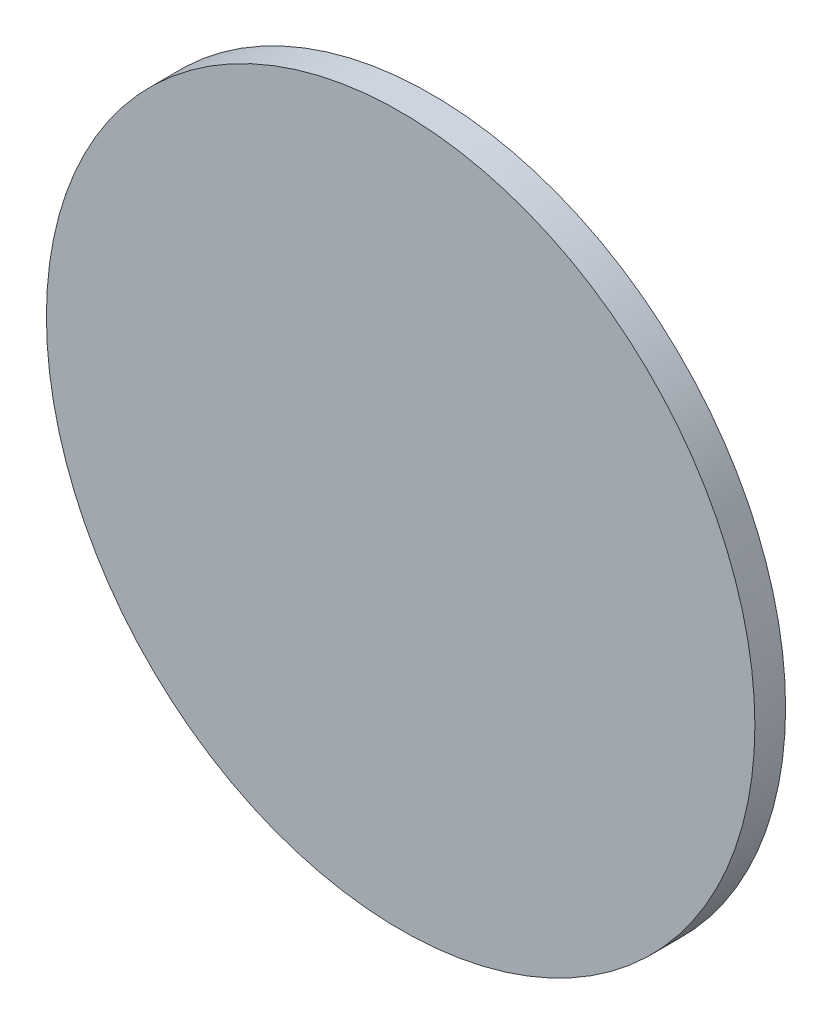
ISO-10303-21;
HEADER;
FILE_DESCRIPTION(('STEP AP214'),'2;1');
FILE_NAME('part.step','',(''),(''),'','','');
FILE_SCHEMA(('AUTOMOTIVE_DESIGN { 1 0 10303 214 1 1 1 1 }'));
ENDSEC;
DATA;
#1=APPLICATION_CONTEXT('core data for automotive mechanical design processes');
#2=APPLICATION_PROTOCOL_DEFINITION('international standard','automotive_design',2000,#1);
#3=PRODUCT_CONTEXT('',#1,'mechanical');
#4=PRODUCT('Part','Part','',(#3));
#5=PRODUCT_RELATED_PRODUCT_CATEGORY('part','',(#4));
#6=PRODUCT_DEFINITION_FORMATION('','',#4);
#7=PRODUCT_DEFINITION_CONTEXT('part definition',#1,'design');
#8=PRODUCT_DEFINITION('design','',#6,#7);
#9=PRODUCT_DEFINITION_SHAPE('','',#8);
#10=(LENGTH_UNIT() NAMED_UNIT(*) SI_UNIT(.MILLI.,.METRE.));
#11=(NAMED_UNIT(*) PLANE_ANGLE_UNIT() SI_UNIT($,.RADIAN.));
#12=(NAMED_UNIT(*) SI_UNIT($,.STERADIAN.) SOLID_ANGLE_UNIT());
#13=UNCERTAINTY_MEASURE_WITH_UNIT(LENGTH_MEASURE(1.E-05),#10,'distance_accuracy_value','');
#14=(GEOMETRIC_REPRESENTATION_CONTEXT(3) GLOBAL_UNCERTAINTY_ASSIGNED_CONTEXT((#13)) GLOBAL_UNIT_ASSIGNED_CONTEXT((#10,
#11,#12)) REPRESENTATION_CONTEXT('',''));
#15=CARTESIAN_POINT('',(0.,0.,0.));
#16=DIRECTION('',(0.,0.,1.));
#17=DIRECTION('',(1.,0.,0.));
#18=AXIS2_PLACEMENT_3D('',#15,#16,#17);
#19=CARTESIAN_POINT('',(0.,0.,2.000000064));
#20=DIRECTION('',(0.,0.,-1.));
#21=DIRECTION('',(-1.,0.,0.));
#22=AXIS2_PLACEMENT_3D('',#19,#20,#21);
#23=CYLINDRICAL_SURFACE('',#22,23.07082);
#24=CARTESIAN_POINT('',(0.,0.,2.000000064));
#25=DIRECTION('',(0.,0.,1.));
#26=DIRECTION('',(1.,0.,0.));
#27=AXIS2_PLACEMENT_3D('',#24,#25,#26);
#28=CIRCLE('',#27,23.07082);
#29=CARTESIAN_POINT('',(23.07082,0.,2.000000064));
#30=VERTEX_POINT('',#29);
#31=EDGE_CURVE('E10',#30,#30,#28,.T.);
#32=ORIENTED_EDGE('',*,*,#31,.F.);
#33=EDGE_LOOP('',(#32));
#34=FACE_BOUND('',#33,.T.);
#35=CARTESIAN_POINT('',(0.,0.,0.));
#36=DIRECTION('',(0.,0.,1.));
#37=DIRECTION('',(1.,0.,0.));
#38=AXIS2_PLACEMENT_3D('',#35,#36,#37);
#39=CIRCLE('',#38,23.07082);
#40=CARTESIAN_POINT('',(23.07082,0.,0.));
#41=VERTEX_POINT('',#40);
#42=EDGE_CURVE('E36',#41,#41,#39,.T.);
#43=ORIENTED_EDGE('',*,*,#42,.T.);
#44=EDGE_LOOP('',(#43));
#45=FACE_BOUND('',#44,.T.);
#46=ADVANCED_FACE('F30',(#34,#45),#23,.T.);
#47=CARTESIAN_POINT('',(0.,0.,2.000000064));
#48=DIRECTION('',(0.,0.,1.));
#49=DIRECTION('',(1.,0.,0.));
#50=AXIS2_PLACEMENT_3D('',#47,#48,#49);
#51=PLANE('',#50);
#52=ORIENTED_EDGE('',*,*,#31,.T.);
#53=EDGE_LOOP('',(#52));
#54=FACE_BOUND('',#53,.T.);
#55=ADVANCED_FACE('F45',(#54),#51,.T.);
#56=CARTESIAN_POINT('',(0.,0.,0.));
#57=DIRECTION('',(0.,0.,1.));
#58=DIRECTION('',(1.,0.,0.));
#59=AXIS2_PLACEMENT_3D('',#56,#57,#58);
#60=PLANE('',#59);
#61=ORIENTED_EDGE('',*,*,#42,.F.);
#62=EDGE_LOOP('',(#61));
#63=FACE_BOUND('',#62,.T.);
#64=ADVANCED_FACE('F43',(#63),#60,.F.);
#65=CLOSED_SHELL('',(#46,#55,#64));
#66=MANIFOLD_SOLID_BREP('B2',#65);
#67=ADVANCED_BREP_SHAPE_REPRESENTATION('',(#18,#66),#14);
#68=SHAPE_DEFINITION_REPRESENTATION(#9,#67);
ENDSEC;
END-ISO-10303-21;
